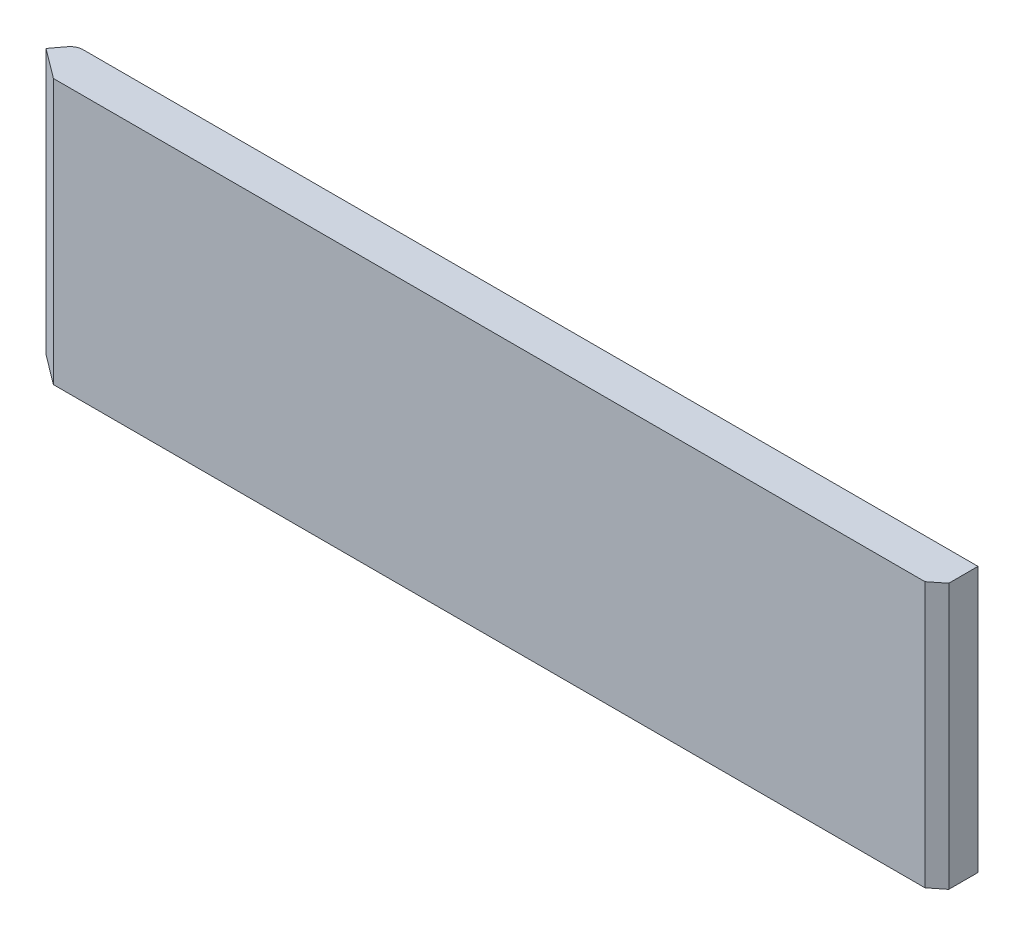
ISO-10303-21;
HEADER;
FILE_DESCRIPTION(('STEP AP214'),'2;1');
FILE_NAME('part.step','',(''),(''),'','','');
FILE_SCHEMA(('AUTOMOTIVE_DESIGN { 1 0 10303 214 1 1 1 1 }'));
ENDSEC;
DATA;
#1=APPLICATION_CONTEXT('core data for automotive mechanical design processes');
#2=APPLICATION_PROTOCOL_DEFINITION('international standard','automotive_design',2000,#1);
#3=PRODUCT_CONTEXT('',#1,'mechanical');
#4=PRODUCT('Part','Part','',(#3));
#5=PRODUCT_RELATED_PRODUCT_CATEGORY('part','',(#4));
#6=PRODUCT_DEFINITION_FORMATION('','',#4);
#7=PRODUCT_DEFINITION_CONTEXT('part definition',#1,'design');
#8=PRODUCT_DEFINITION('design','',#6,#7);
#9=PRODUCT_DEFINITION_SHAPE('','',#8);
#10=(LENGTH_UNIT() NAMED_UNIT(*) SI_UNIT(.MILLI.,.METRE.));
#11=(NAMED_UNIT(*) PLANE_ANGLE_UNIT() SI_UNIT($,.RADIAN.));
#12=(NAMED_UNIT(*) SI_UNIT($,.STERADIAN.) SOLID_ANGLE_UNIT());
#13=UNCERTAINTY_MEASURE_WITH_UNIT(LENGTH_MEASURE(1.E-05),#10,'distance_accuracy_value','');
#14=(GEOMETRIC_REPRESENTATION_CONTEXT(3) GLOBAL_UNCERTAINTY_ASSIGNED_CONTEXT((#13)) GLOBAL_UNIT_ASSIGNED_CONTEXT((#10,
#11,#12)) REPRESENTATION_CONTEXT('',''));
#15=CARTESIAN_POINT('',(0.,0.,0.));
#16=DIRECTION('',(0.,0.,1.));
#17=DIRECTION('',(1.,0.,0.));
#18=AXIS2_PLACEMENT_3D('',#15,#16,#17);
#19=CARTESIAN_POINT('',(77.5,20.,-33.9999999999998));
#20=DIRECTION('',(0.,0.,-1.));
#21=DIRECTION('',(-1.,0.,0.));
#22=AXIS2_PLACEMENT_3D('',#19,#20,#21);
#23=PLANE('',#22);
#24=DIRECTION('',(0.,-1.,0.));
#25=VECTOR('',#24,1.);
#26=CARTESIAN_POINT('',(53.9800000000001,20.,-33.9999999999998));
#27=LINE('',#26,#25);
#28=CARTESIAN_POINT('',(53.9800000000001,20.,-33.9999999999998));
#29=VERTEX_POINT('',#28);
#30=CARTESIAN_POINT('',(53.9800000000001,-20.,-33.9999999999998));
#31=VERTEX_POINT('',#30);
#32=EDGE_CURVE('E63',#29,#31,#27,.T.);
#33=ORIENTED_EDGE('',*,*,#32,.F.);
#34=DIRECTION('',(1.,0.,0.));
#35=VECTOR('',#34,1.);
#36=CARTESIAN_POINT('',(0.,20.,-33.9999999999998));
#37=LINE('',#36,#35);
#38=CARTESIAN_POINT('',(-77.5,20.,-33.9999999999998));
#39=VERTEX_POINT('',#38);
#40=EDGE_CURVE('E126',#39,#29,#37,.T.);
#41=ORIENTED_EDGE('',*,*,#40,.F.);
#42=DIRECTION('',(0.,-1.,0.));
#43=VECTOR('',#42,1.);
#44=CARTESIAN_POINT('',(-77.5,20.,-33.9999999999998));
#45=LINE('',#44,#43);
#46=CARTESIAN_POINT('',(-77.5,-20.,-33.9999999999998));
#47=VERTEX_POINT('',#46);
#48=EDGE_CURVE('E107',#39,#47,#45,.T.);
#49=ORIENTED_EDGE('',*,*,#48,.T.);
#50=DIRECTION('',(-1.,0.,0.));
#51=VECTOR('',#50,1.);
#52=CARTESIAN_POINT('',(77.5,-20.,-33.9999999999998));
#53=LINE('',#52,#51);
#54=EDGE_CURVE('E155',#47,#31,#53,.F.);
#55=ORIENTED_EDGE('',*,*,#54,.T.);
#56=EDGE_LOOP('',(#33,#41,#49,#55));
#57=FACE_BOUND('',#56,.T.);
#58=ADVANCED_FACE('F44',(#57),#23,.F.);
#59=CARTESIAN_POINT('',(0.,20.,0.));
#60=DIRECTION('',(0.,-1.,0.));
#61=DIRECTION('',(0.,0.,-1.));
#62=AXIS2_PLACEMENT_3D('',#59,#60,#61);
#63=PLANE('',#62);
#64=ORIENTED_EDGE('',*,*,#40,.T.);
#65=DIRECTION('',(0.783151105290948,0.,-0.621831445233808));
#66=VECTOR('',#65,1.);
#67=CARTESIAN_POINT('',(55.9800000000001,20.,-35.5880241783039));
#68=LINE('',#67,#66);
#69=CARTESIAN_POINT('',(55.9800000000001,20.,-35.5880241783039));
#70=VERTEX_POINT('',#69);
#71=EDGE_CURVE('E160',#29,#70,#68,.T.);
#72=ORIENTED_EDGE('',*,*,#71,.T.);
#73=DIRECTION('',(0.,0.,1.));
#74=VECTOR('',#73,1.);
#75=CARTESIAN_POINT('',(55.9800000000001,20.,-39.9999999999998));
#76=LINE('',#75,#74);
#77=CARTESIAN_POINT('',(55.9800000000001,20.,-39.9999999999998));
#78=VERTEX_POINT('',#77);
#79=EDGE_CURVE('E146',#78,#70,#76,.T.);
#80=ORIENTED_EDGE('',*,*,#79,.F.);
#81=DIRECTION('',(-1.,0.,0.));
#82=VECTOR('',#81,1.);
#83=CARTESIAN_POINT('',(-80.,20.,-39.9999999999998));
#84=LINE('',#83,#82);
#85=CARTESIAN_POINT('',(-79.,20.,-39.9999999999998));
#86=VERTEX_POINT('',#85);
#87=EDGE_CURVE('E133',#78,#86,#84,.T.);
#88=ORIENTED_EDGE('',*,*,#87,.T.);
#89=CARTESIAN_POINT('',(-79.,20.,-37.9999999999998));
#90=DIRECTION('',(0.,-1.,0.));
#91=DIRECTION('',(0.,0.,-1.));
#92=AXIS2_PLACEMENT_3D('',#89,#90,#91);
#93=CIRCLE('',#92,2.);
#94=CARTESIAN_POINT('',(-80.6,20.,-39.1999999999998));
#95=VERTEX_POINT('',#94);
#96=EDGE_CURVE('E57',#86,#95,#93,.F.);
#97=ORIENTED_EDGE('',*,*,#96,.T.);
#98=DIRECTION('',(-0.6,0.,0.8));
#99=VECTOR('',#98,1.);
#100=CARTESIAN_POINT('',(-110.,20.,1.76566830699974E-13));
#101=LINE('',#100,#99);
#102=CARTESIAN_POINT('',(-81.98,20.,-37.3599999999998));
#103=VERTEX_POINT('',#102);
#104=EDGE_CURVE('E125',#95,#103,#101,.T.);
#105=ORIENTED_EDGE('',*,*,#104,.T.);
#106=DIRECTION('',(0.8,0.,0.6));
#107=VECTOR('',#106,1.);
#108=CARTESIAN_POINT('',(-11.5800000000001,20.,15.4400000000001));
#109=LINE('',#108,#107);
#110=EDGE_CURVE('E115',#103,#39,#109,.T.);
#111=ORIENTED_EDGE('',*,*,#110,.T.);
#112=EDGE_LOOP('',(#64,#72,#80,#88,#97,#105,#111));
#113=FACE_BOUND('',#112,.T.);
#114=ADVANCED_FACE('F130',(#113),#63,.F.);
#115=CARTESIAN_POINT('',(0.,-20.,0.));
#116=DIRECTION('',(0.,-1.,0.));
#117=DIRECTION('',(0.,0.,-1.));
#118=AXIS2_PLACEMENT_3D('',#115,#116,#117);
#119=PLANE('',#118);
#120=DIRECTION('',(0.783151105290948,0.,-0.621831445233808));
#121=VECTOR('',#120,1.);
#122=CARTESIAN_POINT('',(4.31508976853524,-20.,5.43453913043493));
#123=LINE('',#122,#121);
#124=CARTESIAN_POINT('',(55.98,-20.,-35.5880241783039));
#125=VERTEX_POINT('',#124);
#126=EDGE_CURVE('E157',#31,#125,#123,.T.);
#127=ORIENTED_EDGE('',*,*,#126,.F.);
#128=ORIENTED_EDGE('',*,*,#54,.F.);
#129=DIRECTION('',(0.8,0.,0.6));
#130=VECTOR('',#129,1.);
#131=CARTESIAN_POINT('',(-101.18,-20.,-51.7599999999998));
#132=LINE('',#131,#130);
#133=CARTESIAN_POINT('',(-81.98,-20.,-37.3599999999998));
#134=VERTEX_POINT('',#133);
#135=EDGE_CURVE('E114',#134,#47,#132,.T.);
#136=ORIENTED_EDGE('',*,*,#135,.F.);
#137=DIRECTION('',(-0.6,0.,0.8));
#138=VECTOR('',#137,1.);
#139=CARTESIAN_POINT('',(-110.,-20.,1.76566830699974E-13));
#140=LINE('',#139,#138);
#141=CARTESIAN_POINT('',(-80.6,-20.,-39.1999999999998));
#142=VERTEX_POINT('',#141);
#143=EDGE_CURVE('E137',#142,#134,#140,.T.);
#144=ORIENTED_EDGE('',*,*,#143,.F.);
#145=CARTESIAN_POINT('',(-79.,-20.,-37.9999999999998));
#146=DIRECTION('',(0.,-1.,0.));
#147=DIRECTION('',(0.,0.,-1.));
#148=AXIS2_PLACEMENT_3D('',#145,#146,#147);
#149=CIRCLE('',#148,2.);
#150=CARTESIAN_POINT('',(-79.,-20.,-39.9999999999998));
#151=VERTEX_POINT('',#150);
#152=EDGE_CURVE('E202',#142,#151,#149,.T.);
#153=ORIENTED_EDGE('',*,*,#152,.T.);
#154=DIRECTION('',(-1.,0.,0.));
#155=VECTOR('',#154,1.);
#156=CARTESIAN_POINT('',(-80.,-20.,-39.9999999999998));
#157=LINE('',#156,#155);
#158=CARTESIAN_POINT('',(55.98,-20.,-39.9999999999998));
#159=VERTEX_POINT('',#158);
#160=EDGE_CURVE('E144',#159,#151,#157,.T.);
#161=ORIENTED_EDGE('',*,*,#160,.F.);
#162=DIRECTION('',(0.,0.,-1.));
#163=VECTOR('',#162,1.);
#164=CARTESIAN_POINT('',(55.98,-20.,0.));
#165=LINE('',#164,#163);
#166=EDGE_CURVE('E47',#159,#125,#165,.F.);
#167=ORIENTED_EDGE('',*,*,#166,.T.);
#168=EDGE_LOOP('',(#127,#128,#136,#144,#153,#161,#167));
#169=FACE_BOUND('',#168,.T.);
#170=CARTESIAN_POINT('',(52.,-20.,-36.9999999999998));
#171=DIRECTION('',(0.,1.,0.));
#172=DIRECTION('',(0.,0.,1.));
#173=AXIS2_PLACEMENT_3D('',#170,#171,#172);
#174=CIRCLE('',#173,1.57251587518237);
#175=CARTESIAN_POINT('',(52.,-20.,-35.4274841248174));
#176=VERTEX_POINT('',#175);
#177=EDGE_CURVE('E194',#176,#176,#174,.T.);
#178=ORIENTED_EDGE('',*,*,#177,.T.);
#179=EDGE_LOOP('',(#178));
#180=FACE_BOUND('',#179,.T.);
#181=CARTESIAN_POINT('',(7.,-20.,-36.9999999999998));
#182=DIRECTION('',(0.,1.,0.));
#183=DIRECTION('',(0.,0.,-1.));
#184=AXIS2_PLACEMENT_3D('',#181,#182,#183);
#185=CIRCLE('',#184,1.5);
#186=CARTESIAN_POINT('',(7.,-20.,-38.4999999999998));
#187=VERTEX_POINT('',#186);
#188=EDGE_CURVE('E187',#187,#187,#185,.T.);
#189=ORIENTED_EDGE('',*,*,#188,.T.);
#190=EDGE_LOOP('',(#189));
#191=FACE_BOUND('',#190,.T.);
#192=CARTESIAN_POINT('',(-7.,-20.,-36.9999999999998));
#193=DIRECTION('',(0.,1.,0.));
#194=DIRECTION('',(0.,0.,1.));
#195=AXIS2_PLACEMENT_3D('',#192,#193,#194);
#196=CIRCLE('',#195,1.5);
#197=CARTESIAN_POINT('',(-7.,-20.,-35.4999999999998));
#198=VERTEX_POINT('',#197);
#199=EDGE_CURVE('E177',#198,#198,#196,.T.);
#200=ORIENTED_EDGE('',*,*,#199,.T.);
#201=EDGE_LOOP('',(#200));
#202=FACE_BOUND('',#201,.T.);
#203=CARTESIAN_POINT('',(-57.,-20.,-36.9999999999998));
#204=DIRECTION('',(0.,1.,0.));
#205=DIRECTION('',(0.,0.,1.));
#206=AXIS2_PLACEMENT_3D('',#203,#204,#205);
#207=CIRCLE('',#206,1.5);
#208=CARTESIAN_POINT('',(-57.,-20.,-35.4999999999998));
#209=VERTEX_POINT('',#208);
#210=EDGE_CURVE('E161',#209,#209,#207,.T.);
#211=ORIENTED_EDGE('',*,*,#210,.T.);
#212=EDGE_LOOP('',(#211));
#213=FACE_BOUND('',#212,.T.);
#214=ADVANCED_FACE('F217',(#169,#180,#191,#202,#213),#119,.T.);
#215=CARTESIAN_POINT('',(-80.,20.,-39.9999999999998));
#216=DIRECTION('',(0.,0.,1.));
#217=DIRECTION('',(1.,0.,0.));
#218=AXIS2_PLACEMENT_3D('',#215,#216,#217);
#219=PLANE('',#218);
#220=ORIENTED_EDGE('',*,*,#87,.F.);
#221=DIRECTION('',(0.,-1.,0.));
#222=VECTOR('',#221,1.);
#223=CARTESIAN_POINT('',(55.9800000000001,-20.,-39.9999999999998));
#224=LINE('',#223,#222);
#225=EDGE_CURVE('E89',#78,#159,#224,.T.);
#226=ORIENTED_EDGE('',*,*,#225,.T.);
#227=ORIENTED_EDGE('',*,*,#160,.T.);
#228=DIRECTION('',(0.,-1.,0.));
#229=VECTOR('',#228,1.);
#230=CARTESIAN_POINT('',(-79.,20.,-39.9999999999998));
#231=LINE('',#230,#229);
#232=EDGE_CURVE('E122',#151,#86,#231,.F.);
#233=ORIENTED_EDGE('',*,*,#232,.T.);
#234=EDGE_LOOP('',(#220,#226,#227,#233));
#235=FACE_BOUND('',#234,.T.);
#236=ADVANCED_FACE('F226',(#235),#219,.F.);
#237=CARTESIAN_POINT('',(-110.,20.,1.76566830699974E-13));
#238=DIRECTION('',(0.8,0.,0.6));
#239=DIRECTION('',(0.6,0.,-0.8));
#240=AXIS2_PLACEMENT_3D('',#237,#238,#239);
#241=PLANE('',#240);
#242=ORIENTED_EDGE('',*,*,#143,.T.);
#243=DIRECTION('',(0.,1.,0.));
#244=VECTOR('',#243,1.);
#245=CARTESIAN_POINT('',(-81.98,20.,-37.3599999999998));
#246=LINE('',#245,#244);
#247=EDGE_CURVE('E134',#134,#103,#246,.T.);
#248=ORIENTED_EDGE('',*,*,#247,.T.);
#249=ORIENTED_EDGE('',*,*,#104,.F.);
#250=DIRECTION('',(0.,-1.,0.));
#251=VECTOR('',#250,1.);
#252=CARTESIAN_POINT('',(-80.6,20.,-39.1999999999998));
#253=LINE('',#252,#251);
#254=EDGE_CURVE('E11',#95,#142,#253,.T.);
#255=ORIENTED_EDGE('',*,*,#254,.T.);
#256=EDGE_LOOP('',(#242,#248,#249,#255));
#257=FACE_BOUND('',#256,.T.);
#258=ADVANCED_FACE('F215',(#257),#241,.F.);
#259=CARTESIAN_POINT('',(52.,-20.,-36.9999999999998));
#260=DIRECTION('',(0.,1.,0.));
#261=DIRECTION('',(0.,0.,1.));
#262=AXIS2_PLACEMENT_3D('',#259,#260,#261);
#263=CYLINDRICAL_SURFACE('',#262,1.57251587518237);
#264=ORIENTED_EDGE('',*,*,#177,.F.);
#265=EDGE_LOOP('',(#264));
#266=FACE_BOUND('',#265,.T.);
#267=CARTESIAN_POINT('',(52.,-15.,-36.9999999999998));
#268=DIRECTION('',(0.,1.,0.));
#269=DIRECTION('',(0.,0.,1.));
#270=AXIS2_PLACEMENT_3D('',#267,#268,#269);
#271=CIRCLE('',#270,1.57251587518237);
#272=CARTESIAN_POINT('',(52.,-15.,-35.4274841248174));
#273=VERTEX_POINT('',#272);
#274=EDGE_CURVE('E186',#273,#273,#271,.T.);
#275=ORIENTED_EDGE('',*,*,#274,.T.);
#276=EDGE_LOOP('',(#275));
#277=FACE_BOUND('',#276,.T.);
#278=ADVANCED_FACE('F234',(#266,#277),#263,.F.);
#279=CARTESIAN_POINT('',(52.,-15.,-36.9999999999998));
#280=DIRECTION('',(0.,1.,0.));
#281=DIRECTION('',(0.,0.,1.));
#282=AXIS2_PLACEMENT_3D('',#279,#280,#281);
#283=PLANE('',#282);
#284=ORIENTED_EDGE('',*,*,#274,.F.);
#285=EDGE_LOOP('',(#284));
#286=FACE_BOUND('',#285,.T.);
#287=ADVANCED_FACE('F243',(#286),#283,.F.);
#288=CARTESIAN_POINT('',(7.,-20.,-36.9999999999998));
#289=DIRECTION('',(0.,1.,0.));
#290=DIRECTION('',(0.,0.,1.));
#291=AXIS2_PLACEMENT_3D('',#288,#289,#290);
#292=CYLINDRICAL_SURFACE('',#291,1.5);
#293=ORIENTED_EDGE('',*,*,#188,.F.);
#294=EDGE_LOOP('',(#293));
#295=FACE_BOUND('',#294,.T.);
#296=CARTESIAN_POINT('',(7.,-15.,-36.9999999999998));
#297=DIRECTION('',(0.,1.,0.));
#298=DIRECTION('',(0.,0.,-1.));
#299=AXIS2_PLACEMENT_3D('',#296,#297,#298);
#300=CIRCLE('',#299,1.5);
#301=CARTESIAN_POINT('',(7.,-15.,-38.4999999999998));
#302=VERTEX_POINT('',#301);
#303=EDGE_CURVE('E185',#302,#302,#300,.T.);
#304=ORIENTED_EDGE('',*,*,#303,.T.);
#305=EDGE_LOOP('',(#304));
#306=FACE_BOUND('',#305,.T.);
#307=ADVANCED_FACE('F246',(#295,#306),#292,.F.);
#308=CARTESIAN_POINT('',(7.,-15.,-36.9999999999998));
#309=DIRECTION('',(0.,-1.,0.));
#310=DIRECTION('',(0.,0.,-1.));
#311=AXIS2_PLACEMENT_3D('',#308,#309,#310);
#312=PLANE('',#311);
#313=ORIENTED_EDGE('',*,*,#303,.F.);
#314=EDGE_LOOP('',(#313));
#315=FACE_BOUND('',#314,.T.);
#316=ADVANCED_FACE('F252',(#315),#312,.T.);
#317=CARTESIAN_POINT('',(-7.,-20.,-36.9999999999998));
#318=DIRECTION('',(0.,1.,0.));
#319=DIRECTION('',(0.,0.,1.));
#320=AXIS2_PLACEMENT_3D('',#317,#318,#319);
#321=CYLINDRICAL_SURFACE('',#320,1.5);
#322=ORIENTED_EDGE('',*,*,#199,.F.);
#323=EDGE_LOOP('',(#322));
#324=FACE_BOUND('',#323,.T.);
#325=CARTESIAN_POINT('',(-7.,-15.,-36.9999999999998));
#326=DIRECTION('',(0.,1.,0.));
#327=DIRECTION('',(0.,0.,1.));
#328=AXIS2_PLACEMENT_3D('',#325,#326,#327);
#329=CIRCLE('',#328,1.5);
#330=CARTESIAN_POINT('',(-7.,-15.,-35.4999999999998));
#331=VERTEX_POINT('',#330);
#332=EDGE_CURVE('E171',#331,#331,#329,.T.);
#333=ORIENTED_EDGE('',*,*,#332,.T.);
#334=EDGE_LOOP('',(#333));
#335=FACE_BOUND('',#334,.T.);
#336=ADVANCED_FACE('F251',(#324,#335),#321,.F.);
#337=CARTESIAN_POINT('',(-7.,-15.,-36.9999999999998));
#338=DIRECTION('',(0.,1.,0.));
#339=DIRECTION('',(0.,0.,1.));
#340=AXIS2_PLACEMENT_3D('',#337,#338,#339);
#341=PLANE('',#340);
#342=ORIENTED_EDGE('',*,*,#332,.F.);
#343=EDGE_LOOP('',(#342));
#344=FACE_BOUND('',#343,.T.);
#345=ADVANCED_FACE('F256',(#344),#341,.F.);
#346=CARTESIAN_POINT('',(-57.,-20.,-36.9999999999998));
#347=DIRECTION('',(0.,1.,0.));
#348=DIRECTION('',(0.,0.,1.));
#349=AXIS2_PLACEMENT_3D('',#346,#347,#348);
#350=CYLINDRICAL_SURFACE('',#349,1.5);
#351=ORIENTED_EDGE('',*,*,#210,.F.);
#352=EDGE_LOOP('',(#351));
#353=FACE_BOUND('',#352,.T.);
#354=CARTESIAN_POINT('',(-57.,-15.,-36.9999999999998));
#355=DIRECTION('',(0.,1.,0.));
#356=DIRECTION('',(0.,0.,1.));
#357=AXIS2_PLACEMENT_3D('',#354,#355,#356);
#358=CIRCLE('',#357,1.5);
#359=CARTESIAN_POINT('',(-57.,-15.,-35.4999999999998));
#360=VERTEX_POINT('',#359);
#361=EDGE_CURVE('E159',#360,#360,#358,.T.);
#362=ORIENTED_EDGE('',*,*,#361,.T.);
#363=EDGE_LOOP('',(#362));
#364=FACE_BOUND('',#363,.T.);
#365=ADVANCED_FACE('F264',(#353,#364),#350,.F.);
#366=CARTESIAN_POINT('',(-57.,-15.,-36.9999999999998));
#367=DIRECTION('',(0.,1.,0.));
#368=DIRECTION('',(0.,0.,1.));
#369=AXIS2_PLACEMENT_3D('',#366,#367,#368);
#370=PLANE('',#369);
#371=ORIENTED_EDGE('',*,*,#361,.F.);
#372=EDGE_LOOP('',(#371));
#373=FACE_BOUND('',#372,.T.);
#374=ADVANCED_FACE('F270',(#373),#370,.F.);
#375=CARTESIAN_POINT('',(-79.,20.,-37.9999999999998));
#376=DIRECTION('',(0.,-1.,0.));
#377=DIRECTION('',(0.,0.,-1.));
#378=AXIS2_PLACEMENT_3D('',#375,#376,#377);
#379=CYLINDRICAL_SURFACE('',#378,2.);
#380=ORIENTED_EDGE('',*,*,#96,.F.);
#381=ORIENTED_EDGE('',*,*,#232,.F.);
#382=ORIENTED_EDGE('',*,*,#152,.F.);
#383=ORIENTED_EDGE('',*,*,#254,.F.);
#384=EDGE_LOOP('',(#380,#381,#382,#383));
#385=FACE_BOUND('',#384,.T.);
#386=ADVANCED_FACE('F50',(#385),#379,.T.);
#387=CARTESIAN_POINT('',(-101.18,-20.,-51.7599999999998));
#388=DIRECTION('',(0.6,0.,-0.8));
#389=DIRECTION('',(-0.8,0.,-0.6));
#390=AXIS2_PLACEMENT_3D('',#387,#388,#389);
#391=PLANE('',#390);
#392=ORIENTED_EDGE('',*,*,#110,.F.);
#393=ORIENTED_EDGE('',*,*,#247,.F.);
#394=ORIENTED_EDGE('',*,*,#135,.T.);
#395=ORIENTED_EDGE('',*,*,#48,.F.);
#396=EDGE_LOOP('',(#392,#393,#394,#395));
#397=FACE_BOUND('',#396,.T.);
#398=ADVANCED_FACE('F111',(#397),#391,.F.);
#399=CARTESIAN_POINT('',(55.9800000000001,-20.,-39.9999999999998));
#400=DIRECTION('',(-1.,0.,0.));
#401=DIRECTION('',(0.,0.,1.));
#402=AXIS2_PLACEMENT_3D('',#399,#400,#401);
#403=PLANE('',#402);
#404=ORIENTED_EDGE('',*,*,#79,.T.);
#405=DIRECTION('',(0.,-1.,0.));
#406=VECTOR('',#405,1.);
#407=CARTESIAN_POINT('',(55.9800000000001,20.,-35.5880241783039));
#408=LINE('',#407,#406);
#409=EDGE_CURVE('E148',#70,#125,#408,.T.);
#410=ORIENTED_EDGE('',*,*,#409,.T.);
#411=ORIENTED_EDGE('',*,*,#166,.F.);
#412=ORIENTED_EDGE('',*,*,#225,.F.);
#413=EDGE_LOOP('',(#404,#410,#411,#412));
#414=FACE_BOUND('',#413,.T.);
#415=ADVANCED_FACE('F216',(#414),#403,.F.);
#416=CARTESIAN_POINT('',(55.9800000000001,20.,-35.5880241783039));
#417=DIRECTION('',(-0.621831445233808,0.,-0.783151105290948));
#418=DIRECTION('',(-0.783151105290948,0.,0.621831445233808));
#419=AXIS2_PLACEMENT_3D('',#416,#417,#418);
#420=PLANE('',#419);
#421=ORIENTED_EDGE('',*,*,#409,.F.);
#422=ORIENTED_EDGE('',*,*,#71,.F.);
#423=ORIENTED_EDGE('',*,*,#32,.T.);
#424=ORIENTED_EDGE('',*,*,#126,.T.);
#425=EDGE_LOOP('',(#421,#422,#423,#424));
#426=FACE_BOUND('',#425,.T.);
#427=ADVANCED_FACE('F220',(#426),#420,.F.);
#428=CLOSED_SHELL('',(#58,#114,#214,#236,#258,#278,#287,#307,#316,#336,#345,#365,#374,#386,#398,
#415,#427));
#429=MANIFOLD_SOLID_BREP('B2',#428);
#430=ADVANCED_BREP_SHAPE_REPRESENTATION('',(#18,#429),#14);
#431=SHAPE_DEFINITION_REPRESENTATION(#9,#430);
ENDSEC;
END-ISO-10303-21;
